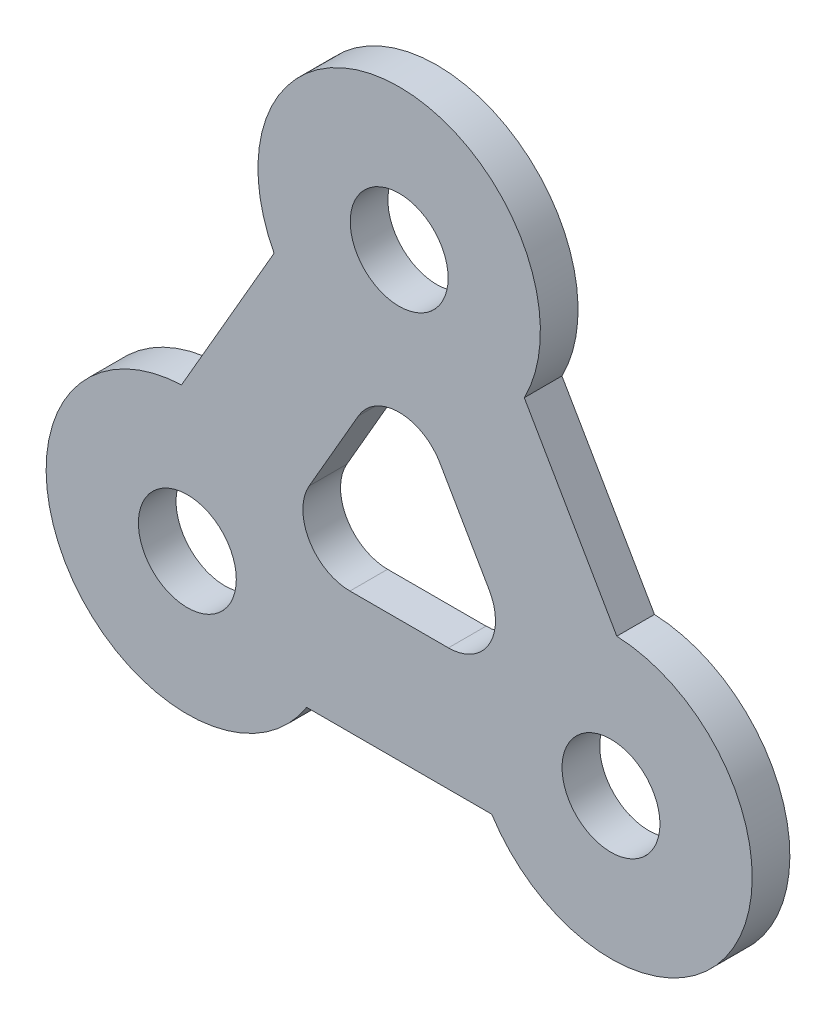
ISO-10303-21;
HEADER;
FILE_DESCRIPTION(('STEP AP214'),'2;1');
FILE_NAME('part.step','',(''),(''),'','','');
FILE_SCHEMA(('AUTOMOTIVE_DESIGN { 1 0 10303 214 1 1 1 1 }'));
ENDSEC;
DATA;
#1=APPLICATION_CONTEXT('core data for automotive mechanical design processes');
#2=APPLICATION_PROTOCOL_DEFINITION('international standard','automotive_design',2000,#1);
#3=PRODUCT_CONTEXT('',#1,'mechanical');
#4=PRODUCT('Part','Part','',(#3));
#5=PRODUCT_RELATED_PRODUCT_CATEGORY('part','',(#4));
#6=PRODUCT_DEFINITION_FORMATION('','',#4);
#7=PRODUCT_DEFINITION_CONTEXT('part definition',#1,'design');
#8=PRODUCT_DEFINITION('design','',#6,#7);
#9=PRODUCT_DEFINITION_SHAPE('','',#8);
#10=(LENGTH_UNIT() NAMED_UNIT(*) SI_UNIT(.MILLI.,.METRE.));
#11=(NAMED_UNIT(*) PLANE_ANGLE_UNIT() SI_UNIT($,.RADIAN.));
#12=(NAMED_UNIT(*) SI_UNIT($,.STERADIAN.) SOLID_ANGLE_UNIT());
#13=UNCERTAINTY_MEASURE_WITH_UNIT(LENGTH_MEASURE(1.E-05),#10,'distance_accuracy_value','');
#14=(GEOMETRIC_REPRESENTATION_CONTEXT(3) GLOBAL_UNCERTAINTY_ASSIGNED_CONTEXT((#13)) GLOBAL_UNIT_ASSIGNED_CONTEXT((#10,
#11,#12)) REPRESENTATION_CONTEXT('',''));
#15=CARTESIAN_POINT('',(0.,0.,0.));
#16=DIRECTION('',(0.,0.,1.));
#17=DIRECTION('',(1.,0.,0.));
#18=AXIS2_PLACEMENT_3D('',#15,#16,#17);
#19=CARTESIAN_POINT('',(-0.291428571428643,20.2141430137214,4.));
#20=DIRECTION('',(0.,0.,1.));
#21=DIRECTION('',(1.,0.,0.));
#22=AXIS2_PLACEMENT_3D('',#19,#20,#21);
#23=PLANE('',#22);
#24=CARTESIAN_POINT('',(22.2085714285714,-18.7570001565784,4.));
#25=DIRECTION('',(0.,0.,1.));
#26=DIRECTION('',(1.,0.,0.));
#27=AXIS2_PLACEMENT_3D('',#24,#25,#26);
#28=CIRCLE('',#27,5.2);
#29=CARTESIAN_POINT('',(27.4085714285714,-18.7570001565784,4.));
#30=VERTEX_POINT('',#29);
#31=EDGE_CURVE('E206',#30,#30,#28,.T.);
#32=ORIENTED_EDGE('',*,*,#31,.F.);
#33=EDGE_LOOP('',(#32));
#34=FACE_BOUND('',#33,.T.);
#35=DIRECTION('',(-0.500000000000004,-0.866025403784436,0.));
#36=VECTOR('',#35,1.);
#37=CARTESIAN_POINT('',(-18.4946225492973,4.74299984342158,4.));
#38=LINE('',#37,#36);
#39=CARTESIAN_POINT('',(-13.579791410665,13.2557370861542,4.));
#40=VERTEX_POINT('',#39);
#41=CARTESIAN_POINT('',(-23.4094536879295,-3.76973739931099,4.));
#42=VERTEX_POINT('',#41);
#43=EDGE_CURVE('E222',#40,#42,#38,.T.);
#44=ORIENTED_EDGE('',*,*,#43,.T.);
#45=CARTESIAN_POINT('',(-22.7914285714286,-18.7570001565784,4.));
#46=DIRECTION('',(0.,0.,1.));
#47=DIRECTION('',(-1.,0.,0.));
#48=AXIS2_PLACEMENT_3D('',#45,#46,#47);
#49=CIRCLE('',#48,15.);
#50=CARTESIAN_POINT('',(-10.1210908486931,-26.7858569862786,4.));
#51=VERTEX_POINT('',#50);
#52=EDGE_CURVE('E225',#42,#51,#49,.T.);
#53=ORIENTED_EDGE('',*,*,#52,.T.);
#54=DIRECTION('',(1.,0.,0.));
#55=VECTOR('',#54,1.);
#56=CARTESIAN_POINT('',(-0.291428571428633,-26.7858569862786,4.));
#57=LINE('',#56,#55);
#58=CARTESIAN_POINT('',(9.53823370583582,-26.7858569862786,4.));
#59=VERTEX_POINT('',#58);
#60=EDGE_CURVE('E229',#51,#59,#57,.T.);
#61=ORIENTED_EDGE('',*,*,#60,.T.);
#62=CARTESIAN_POINT('',(22.2085714285715,-18.7570001565784,4.));
#63=DIRECTION('',(0.,0.,1.));
#64=DIRECTION('',(-1.,0.,0.));
#65=AXIS2_PLACEMENT_3D('',#62,#63,#64);
#66=CIRCLE('',#65,15.0000000000001);
#67=CARTESIAN_POINT('',(22.8265965450723,-3.76973739931098,4.));
#68=VERTEX_POINT('',#67);
#69=EDGE_CURVE('E232',#59,#68,#66,.T.);
#70=ORIENTED_EDGE('',*,*,#69,.T.);
#71=DIRECTION('',(-0.500000000000005,0.866025403784436,0.));
#72=VECTOR('',#71,1.);
#73=CARTESIAN_POINT('',(17.91176540644,4.74299984342158,4.));
#74=LINE('',#73,#72);
#75=CARTESIAN_POINT('',(12.9969342678077,13.2557370861542,4.));
#76=VERTEX_POINT('',#75);
#77=EDGE_CURVE('E235',#68,#76,#74,.T.);
#78=ORIENTED_EDGE('',*,*,#77,.T.);
#79=CARTESIAN_POINT('',(-0.291428571428643,20.2141430137214,4.));
#80=DIRECTION('',(0.,0.,1.));
#81=DIRECTION('',(1.,0.,0.));
#82=AXIS2_PLACEMENT_3D('',#79,#80,#81);
#83=CIRCLE('',#82,15.);
#84=EDGE_CURVE('E238',#76,#40,#83,.T.);
#85=ORIENTED_EDGE('',*,*,#84,.T.);
#86=EDGE_LOOP('',(#44,#53,#61,#70,#78,#85));
#87=FACE_BOUND('',#86,.T.);
#88=CARTESIAN_POINT('',(-0.29142857142864,20.2141430137214,4.));
#89=DIRECTION('',(0.,0.,1.));
#90=DIRECTION('',(1.,0.,0.));
#91=AXIS2_PLACEMENT_3D('',#88,#89,#90);
#92=CIRCLE('',#91,5.2);
#93=CARTESIAN_POINT('',(4.90857142857136,20.2141430137214,4.));
#94=VERTEX_POINT('',#93);
#95=EDGE_CURVE('E214',#94,#94,#92,.T.);
#96=ORIENTED_EDGE('',*,*,#95,.F.);
#97=EDGE_LOOP('',(#96));
#98=FACE_BOUND('',#97,.T.);
#99=CARTESIAN_POINT('',(-22.7914285714286,-18.7570001565784,4.));
#100=DIRECTION('',(0.,0.,1.));
#101=DIRECTION('',(1.,0.,0.));
#102=AXIS2_PLACEMENT_3D('',#99,#100,#101);
#103=CIRCLE('',#102,5.2);
#104=CARTESIAN_POINT('',(-17.5914285714286,-18.7570001565784,4.));
#105=VERTEX_POINT('',#104);
#106=EDGE_CURVE('E198',#105,#105,#103,.T.);
#107=ORIENTED_EDGE('',*,*,#106,.F.);
#108=EDGE_LOOP('',(#107));
#109=FACE_BOUND('',#108,.T.);
#110=DIRECTION('',(-0.500000000000004,0.866025403784436,0.));
#111=VECTOR('',#110,1.);
#112=CARTESIAN_POINT('',(9.26817186699101,-6.28585698627862,4.));
#113=LINE('',#112,#111);
#114=CARTESIAN_POINT('',(9.26817186699101,-6.28585698627862,4.));
#115=VERTEX_POINT('',#114);
#116=CARTESIAN_POINT('',(4.03869844749354,2.77185667312186,4.));
#117=VERTEX_POINT('',#116);
#118=EDGE_CURVE('E138',#115,#117,#113,.T.);
#119=ORIENTED_EDGE('',*,*,#118,.F.);
#120=CARTESIAN_POINT('',(4.9380448480688,-8.78585698627862,4.));
#121=DIRECTION('',(0.,0.,1.));
#122=DIRECTION('',(1.,0.,0.));
#123=AXIS2_PLACEMENT_3D('',#120,#121,#122);
#124=CIRCLE('',#123,5.00000000000002);
#125=CARTESIAN_POINT('',(4.93804484806883,-13.7858569862786,4.));
#126=VERTEX_POINT('',#125);
#127=EDGE_CURVE('E129',#126,#115,#124,.T.);
#128=ORIENTED_EDGE('',*,*,#127,.F.);
#129=DIRECTION('',(1.,0.,0.));
#130=VECTOR('',#129,1.);
#131=CARTESIAN_POINT('',(4.93804484806883,-13.7858569862786,4.));
#132=LINE('',#131,#130);
#133=CARTESIAN_POINT('',(-5.52090199092611,-13.7858569862786,4.));
#134=VERTEX_POINT('',#133);
#135=EDGE_CURVE('E164',#134,#126,#132,.T.);
#136=ORIENTED_EDGE('',*,*,#135,.F.);
#137=CARTESIAN_POINT('',(-5.5209019909261,-8.78585698627863,4.));
#138=DIRECTION('',(0.,0.,1.));
#139=DIRECTION('',(-1.,0.,0.));
#140=AXIS2_PLACEMENT_3D('',#137,#138,#139);
#141=CIRCLE('',#140,5.);
#142=CARTESIAN_POINT('',(-9.85102900984829,-6.28585698627862,4.));
#143=VERTEX_POINT('',#142);
#144=EDGE_CURVE('E161',#143,#134,#141,.T.);
#145=ORIENTED_EDGE('',*,*,#144,.F.);
#146=DIRECTION('',(-0.500000000000004,-0.866025403784436,0.));
#147=VECTOR('',#146,1.);
#148=CARTESIAN_POINT('',(-4.62155559035082,2.77185667312185,4.));
#149=LINE('',#148,#147);
#150=CARTESIAN_POINT('',(-4.62155559035083,2.77185667312185,4.));
#151=VERTEX_POINT('',#150);
#152=EDGE_CURVE('E156',#151,#143,#149,.T.);
#153=ORIENTED_EDGE('',*,*,#152,.F.);
#154=CARTESIAN_POINT('',(-0.291428571428639,0.271856673121823,4.));
#155=DIRECTION('',(0.,0.,1.));
#156=DIRECTION('',(1.,0.,0.));
#157=AXIS2_PLACEMENT_3D('',#154,#155,#156);
#158=CIRCLE('',#157,5.00000000000001);
#159=EDGE_CURVE('E152',#117,#151,#158,.T.);
#160=ORIENTED_EDGE('',*,*,#159,.F.);
#161=EDGE_LOOP('',(#119,#128,#136,#145,#153,#160));
#162=FACE_BOUND('',#161,.T.);
#163=ADVANCED_FACE('F39',(#34,#87,#98,#109,#162),#23,.T.);
#164=CARTESIAN_POINT('',(-0.291428571428643,20.2141430137214,0.));
#165=DIRECTION('',(0.,0.,1.));
#166=DIRECTION('',(1.,0.,0.));
#167=AXIS2_PLACEMENT_3D('',#164,#165,#166);
#168=PLANE('',#167);
#169=CARTESIAN_POINT('',(-22.7914285714286,-18.7570001565784,0.));
#170=DIRECTION('',(0.,0.,1.));
#171=DIRECTION('',(1.,0.,0.));
#172=AXIS2_PLACEMENT_3D('',#169,#170,#171);
#173=CIRCLE('',#172,5.2);
#174=CARTESIAN_POINT('',(-17.5914285714286,-18.7570001565784,0.));
#175=VERTEX_POINT('',#174);
#176=EDGE_CURVE('E147',#175,#175,#173,.T.);
#177=ORIENTED_EDGE('',*,*,#176,.T.);
#178=EDGE_LOOP('',(#177));
#179=FACE_BOUND('',#178,.T.);
#180=CARTESIAN_POINT('',(22.2085714285714,-18.7570001565784,0.));
#181=DIRECTION('',(0.,0.,1.));
#182=DIRECTION('',(1.,0.,0.));
#183=AXIS2_PLACEMENT_3D('',#180,#181,#182);
#184=CIRCLE('',#183,5.2);
#185=CARTESIAN_POINT('',(27.4085714285714,-18.7570001565784,0.));
#186=VERTEX_POINT('',#185);
#187=EDGE_CURVE('E202',#186,#186,#184,.T.);
#188=ORIENTED_EDGE('',*,*,#187,.T.);
#189=EDGE_LOOP('',(#188));
#190=FACE_BOUND('',#189,.T.);
#191=CARTESIAN_POINT('',(-0.29142857142864,20.2141430137214,0.));
#192=DIRECTION('',(0.,0.,1.));
#193=DIRECTION('',(1.,0.,0.));
#194=AXIS2_PLACEMENT_3D('',#191,#192,#193);
#195=CIRCLE('',#194,5.2);
#196=CARTESIAN_POINT('',(4.90857142857136,20.2141430137214,0.));
#197=VERTEX_POINT('',#196);
#198=EDGE_CURVE('E210',#197,#197,#195,.T.);
#199=ORIENTED_EDGE('',*,*,#198,.T.);
#200=EDGE_LOOP('',(#199));
#201=FACE_BOUND('',#200,.T.);
#202=DIRECTION('',(-0.500000000000004,-0.866025403784436,0.));
#203=VECTOR('',#202,1.);
#204=CARTESIAN_POINT('',(-18.4946225492973,4.74299984342158,0.));
#205=LINE('',#204,#203);
#206=CARTESIAN_POINT('',(-13.579791410665,13.2557370861542,0.));
#207=VERTEX_POINT('',#206);
#208=CARTESIAN_POINT('',(-23.4094536879295,-3.76973739931099,0.));
#209=VERTEX_POINT('',#208);
#210=EDGE_CURVE('E218',#207,#209,#205,.T.);
#211=ORIENTED_EDGE('',*,*,#210,.F.);
#212=CARTESIAN_POINT('',(-0.291428571428643,20.2141430137214,0.));
#213=DIRECTION('',(0.,0.,1.));
#214=DIRECTION('',(1.,0.,0.));
#215=AXIS2_PLACEMENT_3D('',#212,#213,#214);
#216=CIRCLE('',#215,15.);
#217=CARTESIAN_POINT('',(12.9969342678077,13.2557370861542,0.));
#218=VERTEX_POINT('',#217);
#219=EDGE_CURVE('E226',#218,#207,#216,.T.);
#220=ORIENTED_EDGE('',*,*,#219,.F.);
#221=DIRECTION('',(-0.500000000000005,0.866025403784436,0.));
#222=VECTOR('',#221,1.);
#223=CARTESIAN_POINT('',(17.91176540644,4.74299984342158,0.));
#224=LINE('',#223,#222);
#225=CARTESIAN_POINT('',(22.8265965450723,-3.76973739931098,0.));
#226=VERTEX_POINT('',#225);
#227=EDGE_CURVE('E255',#226,#218,#224,.T.);
#228=ORIENTED_EDGE('',*,*,#227,.F.);
#229=CARTESIAN_POINT('',(22.2085714285715,-18.7570001565784,0.));
#230=DIRECTION('',(0.,0.,1.));
#231=DIRECTION('',(-1.,0.,0.));
#232=AXIS2_PLACEMENT_3D('',#229,#230,#231);
#233=CIRCLE('',#232,15.0000000000001);
#234=CARTESIAN_POINT('',(9.53823370583582,-26.7858569862786,0.));
#235=VERTEX_POINT('',#234);
#236=EDGE_CURVE('E251',#235,#226,#233,.T.);
#237=ORIENTED_EDGE('',*,*,#236,.F.);
#238=DIRECTION('',(1.,0.,0.));
#239=VECTOR('',#238,1.);
#240=CARTESIAN_POINT('',(-0.291428571428633,-26.7858569862786,0.));
#241=LINE('',#240,#239);
#242=CARTESIAN_POINT('',(-10.1210908486931,-26.7858569862786,0.));
#243=VERTEX_POINT('',#242);
#244=EDGE_CURVE('E248',#243,#235,#241,.T.);
#245=ORIENTED_EDGE('',*,*,#244,.F.);
#246=CARTESIAN_POINT('',(-22.7914285714286,-18.7570001565784,0.));
#247=DIRECTION('',(0.,0.,1.));
#248=DIRECTION('',(-1.,0.,0.));
#249=AXIS2_PLACEMENT_3D('',#246,#247,#248);
#250=CIRCLE('',#249,15.);
#251=EDGE_CURVE('E244',#209,#243,#250,.T.);
#252=ORIENTED_EDGE('',*,*,#251,.F.);
#253=EDGE_LOOP('',(#211,#220,#228,#237,#245,#252));
#254=FACE_BOUND('',#253,.T.);
#255=CARTESIAN_POINT('',(4.9380448480688,-8.78585698627862,0.));
#256=DIRECTION('',(0.,0.,1.));
#257=DIRECTION('',(1.,0.,0.));
#258=AXIS2_PLACEMENT_3D('',#255,#256,#257);
#259=CIRCLE('',#258,5.00000000000002);
#260=CARTESIAN_POINT('',(4.93804484806883,-13.7858569862786,0.));
#261=VERTEX_POINT('',#260);
#262=CARTESIAN_POINT('',(9.26817186699101,-6.28585698627862,0.));
#263=VERTEX_POINT('',#262);
#264=EDGE_CURVE('E63',#261,#263,#259,.T.);
#265=ORIENTED_EDGE('',*,*,#264,.T.);
#266=DIRECTION('',(-0.500000000000004,0.866025403784436,0.));
#267=VECTOR('',#266,1.);
#268=CARTESIAN_POINT('',(9.26817186699101,-6.28585698627862,0.));
#269=LINE('',#268,#267);
#270=CARTESIAN_POINT('',(4.03869844749354,2.77185667312186,0.));
#271=VERTEX_POINT('',#270);
#272=EDGE_CURVE('E145',#263,#271,#269,.T.);
#273=ORIENTED_EDGE('',*,*,#272,.T.);
#274=CARTESIAN_POINT('',(-0.291428571428639,0.271856673121823,0.));
#275=DIRECTION('',(0.,0.,1.));
#276=DIRECTION('',(1.,0.,0.));
#277=AXIS2_PLACEMENT_3D('',#274,#275,#276);
#278=CIRCLE('',#277,5.00000000000001);
#279=CARTESIAN_POINT('',(-4.62155559035083,2.77185667312185,0.));
#280=VERTEX_POINT('',#279);
#281=EDGE_CURVE('E171',#271,#280,#278,.T.);
#282=ORIENTED_EDGE('',*,*,#281,.T.);
#283=DIRECTION('',(-0.500000000000004,-0.866025403784436,0.));
#284=VECTOR('',#283,1.);
#285=CARTESIAN_POINT('',(-4.62155559035082,2.77185667312185,0.));
#286=LINE('',#285,#284);
#287=CARTESIAN_POINT('',(-9.85102900984829,-6.28585698627862,0.));
#288=VERTEX_POINT('',#287);
#289=EDGE_CURVE('E175',#280,#288,#286,.T.);
#290=ORIENTED_EDGE('',*,*,#289,.T.);
#291=CARTESIAN_POINT('',(-5.5209019909261,-8.78585698627863,0.));
#292=DIRECTION('',(0.,0.,1.));
#293=DIRECTION('',(-1.,0.,0.));
#294=AXIS2_PLACEMENT_3D('',#291,#292,#293);
#295=CIRCLE('',#294,5.);
#296=CARTESIAN_POINT('',(-5.52090199092611,-13.7858569862786,0.));
#297=VERTEX_POINT('',#296);
#298=EDGE_CURVE('E179',#288,#297,#295,.T.);
#299=ORIENTED_EDGE('',*,*,#298,.T.);
#300=DIRECTION('',(1.,0.,0.));
#301=VECTOR('',#300,1.);
#302=CARTESIAN_POINT('',(4.93804484806883,-13.7858569862786,0.));
#303=LINE('',#302,#301);
#304=EDGE_CURVE('E139',#297,#261,#303,.T.);
#305=ORIENTED_EDGE('',*,*,#304,.T.);
#306=EDGE_LOOP('',(#265,#273,#282,#290,#299,#305));
#307=FACE_BOUND('',#306,.T.);
#308=ADVANCED_FACE('F288',(#179,#190,#201,#254,#307),#168,.F.);
#309=CARTESIAN_POINT('',(-18.4946225492973,4.74299984342158,4.));
#310=DIRECTION('',(0.866025403784436,-0.500000000000004,0.));
#311=DIRECTION('',(0.500000000000004,0.866025403784436,0.));
#312=AXIS2_PLACEMENT_3D('',#309,#310,#311);
#313=PLANE('',#312);
#314=ORIENTED_EDGE('',*,*,#210,.T.);
#315=DIRECTION('',(0.,0.,-1.));
#316=VECTOR('',#315,1.);
#317=CARTESIAN_POINT('',(-23.4094536879295,-3.76973739931099,4.));
#318=LINE('',#317,#316);
#319=EDGE_CURVE('E11',#42,#209,#318,.T.);
#320=ORIENTED_EDGE('',*,*,#319,.F.);
#321=ORIENTED_EDGE('',*,*,#43,.F.);
#322=DIRECTION('',(0.,0.,-1.));
#323=VECTOR('',#322,1.);
#324=CARTESIAN_POINT('',(-13.579791410665,13.2557370861542,4.));
#325=LINE('',#324,#323);
#326=EDGE_CURVE('E241',#40,#207,#325,.T.);
#327=ORIENTED_EDGE('',*,*,#326,.T.);
#328=EDGE_LOOP('',(#314,#320,#321,#327));
#329=FACE_BOUND('',#328,.T.);
#330=ADVANCED_FACE('F41',(#329),#313,.F.);
#331=CARTESIAN_POINT('',(-22.7914285714286,-18.7570001565784,4.));
#332=DIRECTION('',(0.,0.,-1.));
#333=DIRECTION('',(-1.,0.,0.));
#334=AXIS2_PLACEMENT_3D('',#331,#332,#333);
#335=CYLINDRICAL_SURFACE('',#334,15.);
#336=ORIENTED_EDGE('',*,*,#251,.T.);
#337=DIRECTION('',(0.,0.,-1.));
#338=VECTOR('',#337,1.);
#339=CARTESIAN_POINT('',(-10.1210908486931,-26.7858569862786,4.));
#340=LINE('',#339,#338);
#341=EDGE_CURVE('E48',#51,#243,#340,.T.);
#342=ORIENTED_EDGE('',*,*,#341,.F.);
#343=ORIENTED_EDGE('',*,*,#52,.F.);
#344=ORIENTED_EDGE('',*,*,#319,.T.);
#345=EDGE_LOOP('',(#336,#342,#343,#344));
#346=FACE_BOUND('',#345,.T.);
#347=ADVANCED_FACE('F284',(#346),#335,.T.);
#348=CARTESIAN_POINT('',(-0.291428571428633,-26.7858569862786,4.));
#349=DIRECTION('',(0.,1.,0.));
#350=DIRECTION('',(0.,0.,1.));
#351=AXIS2_PLACEMENT_3D('',#348,#349,#350);
#352=PLANE('',#351);
#353=ORIENTED_EDGE('',*,*,#244,.T.);
#354=DIRECTION('',(0.,0.,-1.));
#355=VECTOR('',#354,1.);
#356=CARTESIAN_POINT('',(9.53823370583582,-26.7858569862786,4.));
#357=LINE('',#356,#355);
#358=EDGE_CURVE('E272',#59,#235,#357,.T.);
#359=ORIENTED_EDGE('',*,*,#358,.F.);
#360=ORIENTED_EDGE('',*,*,#60,.F.);
#361=ORIENTED_EDGE('',*,*,#341,.T.);
#362=EDGE_LOOP('',(#353,#359,#360,#361));
#363=FACE_BOUND('',#362,.T.);
#364=ADVANCED_FACE('F280',(#363),#352,.F.);
#365=CARTESIAN_POINT('',(22.2085714285715,-18.7570001565784,4.));
#366=DIRECTION('',(0.,0.,-1.));
#367=DIRECTION('',(-1.,0.,0.));
#368=AXIS2_PLACEMENT_3D('',#365,#366,#367);
#369=CYLINDRICAL_SURFACE('',#368,15.0000000000001);
#370=ORIENTED_EDGE('',*,*,#236,.T.);
#371=DIRECTION('',(0.,0.,-1.));
#372=VECTOR('',#371,1.);
#373=CARTESIAN_POINT('',(22.8265965450723,-3.76973739931098,4.));
#374=LINE('',#373,#372);
#375=EDGE_CURVE('E268',#68,#226,#374,.T.);
#376=ORIENTED_EDGE('',*,*,#375,.F.);
#377=ORIENTED_EDGE('',*,*,#69,.F.);
#378=ORIENTED_EDGE('',*,*,#358,.T.);
#379=EDGE_LOOP('',(#370,#376,#377,#378));
#380=FACE_BOUND('',#379,.T.);
#381=ADVANCED_FACE('F294',(#380),#369,.T.);
#382=CARTESIAN_POINT('',(17.91176540644,4.74299984342158,4.));
#383=DIRECTION('',(-0.866025403784436,-0.500000000000005,0.));
#384=DIRECTION('',(0.500000000000005,-0.866025403784436,0.));
#385=AXIS2_PLACEMENT_3D('',#382,#383,#384);
#386=PLANE('',#385);
#387=ORIENTED_EDGE('',*,*,#227,.T.);
#388=DIRECTION('',(0.,0.,-1.));
#389=VECTOR('',#388,1.);
#390=CARTESIAN_POINT('',(12.9969342678077,13.2557370861542,4.));
#391=LINE('',#390,#389);
#392=EDGE_CURVE('E264',#76,#218,#391,.T.);
#393=ORIENTED_EDGE('',*,*,#392,.F.);
#394=ORIENTED_EDGE('',*,*,#77,.F.);
#395=ORIENTED_EDGE('',*,*,#375,.T.);
#396=EDGE_LOOP('',(#387,#393,#394,#395));
#397=FACE_BOUND('',#396,.T.);
#398=ADVANCED_FACE('F298',(#397),#386,.F.);
#399=CARTESIAN_POINT('',(-0.291428571428643,20.2141430137214,4.));
#400=DIRECTION('',(0.,0.,-1.));
#401=DIRECTION('',(-1.,0.,0.));
#402=AXIS2_PLACEMENT_3D('',#399,#400,#401);
#403=CYLINDRICAL_SURFACE('',#402,15.);
#404=ORIENTED_EDGE('',*,*,#219,.T.);
#405=ORIENTED_EDGE('',*,*,#326,.F.);
#406=ORIENTED_EDGE('',*,*,#84,.F.);
#407=ORIENTED_EDGE('',*,*,#392,.T.);
#408=EDGE_LOOP('',(#404,#405,#406,#407));
#409=FACE_BOUND('',#408,.T.);
#410=ADVANCED_FACE('F307',(#409),#403,.T.);
#411=CARTESIAN_POINT('',(-0.29142857142864,20.2141430137214,4.));
#412=DIRECTION('',(0.,0.,-1.));
#413=DIRECTION('',(-1.,0.,0.));
#414=AXIS2_PLACEMENT_3D('',#411,#412,#413);
#415=CYLINDRICAL_SURFACE('',#414,5.2);
#416=ORIENTED_EDGE('',*,*,#95,.T.);
#417=EDGE_LOOP('',(#416));
#418=FACE_BOUND('',#417,.T.);
#419=ORIENTED_EDGE('',*,*,#198,.F.);
#420=EDGE_LOOP('',(#419));
#421=FACE_BOUND('',#420,.T.);
#422=ADVANCED_FACE('F309',(#418,#421),#415,.F.);
#423=CARTESIAN_POINT('',(22.2085714285714,-18.7570001565784,4.));
#424=DIRECTION('',(0.,0.,-1.));
#425=DIRECTION('',(-1.,0.,0.));
#426=AXIS2_PLACEMENT_3D('',#423,#424,#425);
#427=CYLINDRICAL_SURFACE('',#426,5.2);
#428=ORIENTED_EDGE('',*,*,#31,.T.);
#429=EDGE_LOOP('',(#428));
#430=FACE_BOUND('',#429,.T.);
#431=ORIENTED_EDGE('',*,*,#187,.F.);
#432=EDGE_LOOP('',(#431));
#433=FACE_BOUND('',#432,.T.);
#434=ADVANCED_FACE('F315',(#430,#433),#427,.F.);
#435=CARTESIAN_POINT('',(-22.7914285714286,-18.7570001565784,4.));
#436=DIRECTION('',(0.,0.,-1.));
#437=DIRECTION('',(-1.,0.,0.));
#438=AXIS2_PLACEMENT_3D('',#435,#436,#437);
#439=CYLINDRICAL_SURFACE('',#438,5.2);
#440=ORIENTED_EDGE('',*,*,#106,.T.);
#441=EDGE_LOOP('',(#440));
#442=FACE_BOUND('',#441,.T.);
#443=ORIENTED_EDGE('',*,*,#176,.F.);
#444=EDGE_LOOP('',(#443));
#445=FACE_BOUND('',#444,.T.);
#446=ADVANCED_FACE('F331',(#442,#445),#439,.F.);
#447=CARTESIAN_POINT('',(4.9380448480688,-8.78585698627862,4.));
#448=DIRECTION('',(0.,0.,-1.));
#449=DIRECTION('',(-1.,0.,0.));
#450=AXIS2_PLACEMENT_3D('',#447,#448,#449);
#451=CYLINDRICAL_SURFACE('',#450,5.00000000000002);
#452=ORIENTED_EDGE('',*,*,#264,.F.);
#453=DIRECTION('',(0.,0.,-1.));
#454=VECTOR('',#453,1.);
#455=CARTESIAN_POINT('',(4.93804484806883,-13.7858569862786,4.));
#456=LINE('',#455,#454);
#457=EDGE_CURVE('E133',#126,#261,#456,.T.);
#458=ORIENTED_EDGE('',*,*,#457,.F.);
#459=ORIENTED_EDGE('',*,*,#127,.T.);
#460=DIRECTION('',(0.,0.,-1.));
#461=VECTOR('',#460,1.);
#462=CARTESIAN_POINT('',(9.26817186699101,-6.28585698627862,4.));
#463=LINE('',#462,#461);
#464=EDGE_CURVE('E132',#115,#263,#463,.T.);
#465=ORIENTED_EDGE('',*,*,#464,.T.);
#466=EDGE_LOOP('',(#452,#458,#459,#465));
#467=FACE_BOUND('',#466,.T.);
#468=ADVANCED_FACE('F131',(#467),#451,.F.);
#469=CARTESIAN_POINT('',(9.26817186699101,-6.28585698627862,4.));
#470=DIRECTION('',(-0.866025403784436,-0.500000000000004,0.));
#471=DIRECTION('',(0.500000000000004,-0.866025403784437,0.));
#472=AXIS2_PLACEMENT_3D('',#469,#470,#471);
#473=PLANE('',#472);
#474=ORIENTED_EDGE('',*,*,#272,.F.);
#475=ORIENTED_EDGE('',*,*,#464,.F.);
#476=ORIENTED_EDGE('',*,*,#118,.T.);
#477=DIRECTION('',(0.,0.,-1.));
#478=VECTOR('',#477,1.);
#479=CARTESIAN_POINT('',(4.03869844749354,2.77185667312186,4.));
#480=LINE('',#479,#478);
#481=EDGE_CURVE('E148',#117,#271,#480,.T.);
#482=ORIENTED_EDGE('',*,*,#481,.T.);
#483=EDGE_LOOP('',(#474,#475,#476,#482));
#484=FACE_BOUND('',#483,.T.);
#485=ADVANCED_FACE('F142',(#484),#473,.T.);
#486=CARTESIAN_POINT('',(-0.291428571428639,0.271856673121823,4.));
#487=DIRECTION('',(0.,0.,-1.));
#488=DIRECTION('',(-1.,0.,0.));
#489=AXIS2_PLACEMENT_3D('',#486,#487,#488);
#490=CYLINDRICAL_SURFACE('',#489,5.00000000000001);
#491=ORIENTED_EDGE('',*,*,#281,.F.);
#492=ORIENTED_EDGE('',*,*,#481,.F.);
#493=ORIENTED_EDGE('',*,*,#159,.T.);
#494=DIRECTION('',(0.,0.,-1.));
#495=VECTOR('',#494,1.);
#496=CARTESIAN_POINT('',(-4.62155559035083,2.77185667312185,4.));
#497=LINE('',#496,#495);
#498=EDGE_CURVE('E193',#151,#280,#497,.T.);
#499=ORIENTED_EDGE('',*,*,#498,.T.);
#500=EDGE_LOOP('',(#491,#492,#493,#499));
#501=FACE_BOUND('',#500,.T.);
#502=ADVANCED_FACE('F340',(#501),#490,.F.);
#503=CARTESIAN_POINT('',(-4.62155559035082,2.77185667312185,4.));
#504=DIRECTION('',(0.866025403784436,-0.500000000000004,0.));
#505=DIRECTION('',(0.500000000000004,0.866025403784437,0.));
#506=AXIS2_PLACEMENT_3D('',#503,#504,#505);
#507=PLANE('',#506);
#508=ORIENTED_EDGE('',*,*,#289,.F.);
#509=ORIENTED_EDGE('',*,*,#498,.F.);
#510=ORIENTED_EDGE('',*,*,#152,.T.);
#511=DIRECTION('',(0.,0.,-1.));
#512=VECTOR('',#511,1.);
#513=CARTESIAN_POINT('',(-9.85102900984829,-6.28585698627862,4.));
#514=LINE('',#513,#512);
#515=EDGE_CURVE('E190',#143,#288,#514,.T.);
#516=ORIENTED_EDGE('',*,*,#515,.T.);
#517=EDGE_LOOP('',(#508,#509,#510,#516));
#518=FACE_BOUND('',#517,.T.);
#519=ADVANCED_FACE('F343',(#518),#507,.T.);
#520=CARTESIAN_POINT('',(-5.5209019909261,-8.78585698627863,4.));
#521=DIRECTION('',(0.,0.,-1.));
#522=DIRECTION('',(-1.,0.,0.));
#523=AXIS2_PLACEMENT_3D('',#520,#521,#522);
#524=CYLINDRICAL_SURFACE('',#523,5.);
#525=ORIENTED_EDGE('',*,*,#298,.F.);
#526=ORIENTED_EDGE('',*,*,#515,.F.);
#527=ORIENTED_EDGE('',*,*,#144,.T.);
#528=DIRECTION('',(0.,0.,-1.));
#529=VECTOR('',#528,1.);
#530=CARTESIAN_POINT('',(-5.52090199092611,-13.7858569862786,4.));
#531=LINE('',#530,#529);
#532=EDGE_CURVE('E55',#134,#297,#531,.T.);
#533=ORIENTED_EDGE('',*,*,#532,.T.);
#534=EDGE_LOOP('',(#525,#526,#527,#533));
#535=FACE_BOUND('',#534,.T.);
#536=ADVANCED_FACE('F347',(#535),#524,.F.);
#537=CARTESIAN_POINT('',(4.93804484806883,-13.7858569862786,4.));
#538=DIRECTION('',(0.,1.,0.));
#539=DIRECTION('',(0.,0.,1.));
#540=AXIS2_PLACEMENT_3D('',#537,#538,#539);
#541=PLANE('',#540);
#542=ORIENTED_EDGE('',*,*,#304,.F.);
#543=ORIENTED_EDGE('',*,*,#532,.F.);
#544=ORIENTED_EDGE('',*,*,#135,.T.);
#545=ORIENTED_EDGE('',*,*,#457,.T.);
#546=EDGE_LOOP('',(#542,#543,#544,#545));
#547=FACE_BOUND('',#546,.T.);
#548=ADVANCED_FACE('F351',(#547),#541,.T.);
#549=CLOSED_SHELL('',(#163,#308,#330,#347,#364,#381,#398,#410,#422,#434,#446,#468,#485,#502,
#519,#536,#548));
#550=MANIFOLD_SOLID_BREP('B2',#549);
#551=ADVANCED_BREP_SHAPE_REPRESENTATION('',(#18,#550),#14);
#552=SHAPE_DEFINITION_REPRESENTATION(#9,#551);
ENDSEC;
END-ISO-10303-21;
